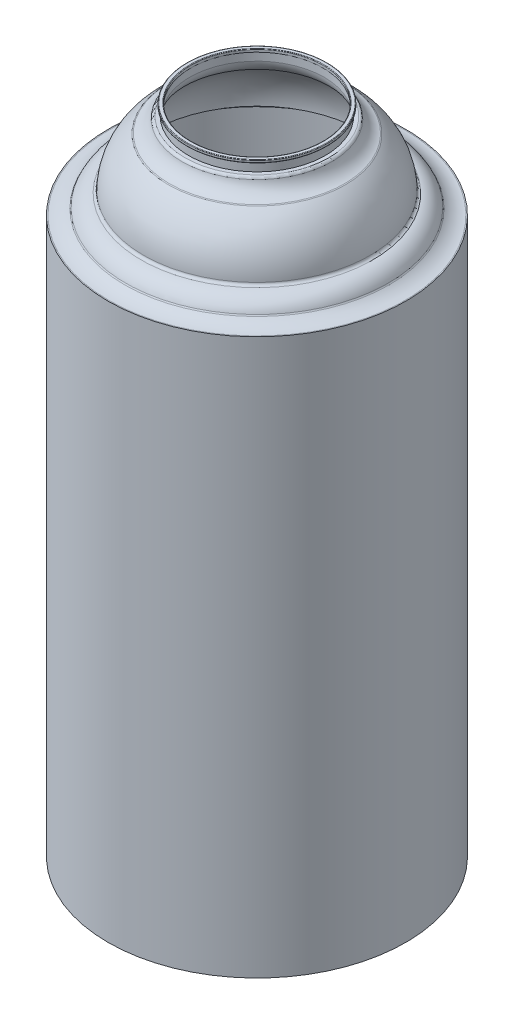
ISO-10303-21;
HEADER;
FILE_DESCRIPTION(('STEP AP214'),'2;1');
FILE_NAME('part.step','',(''),(''),'','','');
FILE_SCHEMA(('AUTOMOTIVE_DESIGN { 1 0 10303 214 1 1 1 1 }'));
ENDSEC;
DATA;
#1=APPLICATION_CONTEXT('core data for automotive mechanical design processes');
#2=APPLICATION_PROTOCOL_DEFINITION('international standard','automotive_design',2000,#1);
#3=PRODUCT_CONTEXT('',#1,'mechanical');
#4=PRODUCT('Part','Part','',(#3));
#5=PRODUCT_RELATED_PRODUCT_CATEGORY('part','',(#4));
#6=PRODUCT_DEFINITION_FORMATION('','',#4);
#7=PRODUCT_DEFINITION_CONTEXT('part definition',#1,'design');
#8=PRODUCT_DEFINITION('design','',#6,#7);
#9=PRODUCT_DEFINITION_SHAPE('','',#8);
#10=(LENGTH_UNIT() NAMED_UNIT(*) SI_UNIT(.MILLI.,.METRE.));
#11=(NAMED_UNIT(*) PLANE_ANGLE_UNIT() SI_UNIT($,.RADIAN.));
#12=(NAMED_UNIT(*) SI_UNIT($,.STERADIAN.) SOLID_ANGLE_UNIT());
#13=UNCERTAINTY_MEASURE_WITH_UNIT(LENGTH_MEASURE(1.E-05),#10,'distance_accuracy_value','');
#14=(GEOMETRIC_REPRESENTATION_CONTEXT(3) GLOBAL_UNCERTAINTY_ASSIGNED_CONTEXT((#13)) GLOBAL_UNIT_ASSIGNED_CONTEXT((#10,
#11,#12)) REPRESENTATION_CONTEXT('',''));
#15=CARTESIAN_POINT('',(0.,0.,0.));
#16=DIRECTION('',(0.,0.,1.));
#17=DIRECTION('',(1.,0.,0.));
#18=AXIS2_PLACEMENT_3D('',#15,#16,#17);
#19=CARTESIAN_POINT('',(4.78249918300067E-13,284.48,0.));
#20=DIRECTION('',(0.,-1.,0.));
#21=DIRECTION('',(0.,0.,-1.));
#22=AXIS2_PLACEMENT_3D('',#19,#20,#21);
#23=PLANE('',#22);
#24=CARTESIAN_POINT('',(0.,284.48,0.));
#25=DIRECTION('',(0.,-1.,0.));
#26=DIRECTION('',(0.,0.,-1.));
#27=AXIS2_PLACEMENT_3D('',#24,#25,#26);
#28=CIRCLE('',#27,31.9798450549602);
#29=CARTESIAN_POINT('',(0.,284.48,-31.9798450549602));
#30=VERTEX_POINT('',#29);
#31=EDGE_CURVE('E115',#30,#30,#28,.F.);
#32=ORIENTED_EDGE('',*,*,#31,.T.);
#33=EDGE_LOOP('',(#32));
#34=FACE_BOUND('',#33,.T.);
#35=CARTESIAN_POINT('',(0.,284.48,0.));
#36=DIRECTION('',(0.,-1.,0.));
#37=DIRECTION('',(0.,0.,-1.));
#38=AXIS2_PLACEMENT_3D('',#35,#36,#37);
#39=CIRCLE('',#38,30.353);
#40=CARTESIAN_POINT('',(0.,284.48,-30.353));
#41=VERTEX_POINT('',#40);
#42=EDGE_CURVE('E73',#41,#41,#39,.F.);
#43=ORIENTED_EDGE('',*,*,#42,.F.);
#44=EDGE_LOOP('',(#43));
#45=FACE_BOUND('',#44,.T.);
#46=ADVANCED_FACE('F41',(#34,#45),#23,.F.);
#47=CARTESIAN_POINT('',(0.,246.38,0.));
#48=DIRECTION('',(0.,1.,0.));
#49=DIRECTION('',(0.,0.,1.));
#50=AXIS2_PLACEMENT_3D('',#47,#48,#49);
#51=PLANE('',#50);
#52=CARTESIAN_POINT('',(0.,246.38,0.));
#53=DIRECTION('',(0.,1.,0.));
#54=DIRECTION('',(0.,0.,1.));
#55=AXIS2_PLACEMENT_3D('',#52,#53,#54);
#56=CIRCLE('',#55,65.5959050012918);
#57=CARTESIAN_POINT('',(0.,246.38,65.5959050012918));
#58=VERTEX_POINT('',#57);
#59=EDGE_CURVE('E87',#58,#58,#56,.F.);
#60=ORIENTED_EDGE('',*,*,#59,.T.);
#61=EDGE_LOOP('',(#60));
#62=FACE_BOUND('',#61,.T.);
#63=CARTESIAN_POINT('',(0.,246.38,0.));
#64=DIRECTION('',(0.,1.,0.));
#65=DIRECTION('',(0.,0.,1.));
#66=AXIS2_PLACEMENT_3D('',#63,#64,#65);
#67=CIRCLE('',#66,66.04);
#68=CARTESIAN_POINT('',(0.,246.38,66.04));
#69=VERTEX_POINT('',#68);
#70=EDGE_CURVE('E127',#69,#69,#67,.T.);
#71=ORIENTED_EDGE('',*,*,#70,.T.);
#72=EDGE_LOOP('',(#71));
#73=FACE_BOUND('',#72,.T.);
#74=ADVANCED_FACE('F195',(#62,#73),#51,.T.);
#75=CARTESIAN_POINT('',(0.,0.,0.));
#76=DIRECTION('',(0.,1.,0.));
#77=DIRECTION('',(0.,0.,1.));
#78=AXIS2_PLACEMENT_3D('',#75,#76,#77);
#79=PLANE('',#78);
#80=CARTESIAN_POINT('',(0.,0.,0.));
#81=DIRECTION('',(0.,1.,0.));
#82=DIRECTION('',(0.,0.,1.));
#83=AXIS2_PLACEMENT_3D('',#80,#81,#82);
#84=CIRCLE('',#83,66.04);
#85=CARTESIAN_POINT('',(0.,0.,66.04));
#86=VERTEX_POINT('',#85);
#87=EDGE_CURVE('E128',#86,#86,#84,.T.);
#88=ORIENTED_EDGE('',*,*,#87,.F.);
#89=EDGE_LOOP('',(#88));
#90=FACE_BOUND('',#89,.T.);
#91=CARTESIAN_POINT('',(0.,0.,0.));
#92=DIRECTION('',(0.,1.,0.));
#93=DIRECTION('',(0.,0.,1.));
#94=AXIS2_PLACEMENT_3D('',#91,#92,#93);
#95=CIRCLE('',#94,64.4525);
#96=CARTESIAN_POINT('',(0.,0.,64.4525));
#97=VERTEX_POINT('',#96);
#98=EDGE_CURVE('E132',#97,#97,#95,.T.);
#99=ORIENTED_EDGE('',*,*,#98,.T.);
#100=EDGE_LOOP('',(#99));
#101=FACE_BOUND('',#100,.T.);
#102=ADVANCED_FACE('F203',(#90,#101),#79,.F.);
#103=CARTESIAN_POINT('',(0.,246.38,0.));
#104=DIRECTION('',(0.,-1.,0.));
#105=DIRECTION('',(0.,0.,-1.));
#106=AXIS2_PLACEMENT_3D('',#103,#104,#105);
#107=CYLINDRICAL_SURFACE('',#106,66.04);
#108=ORIENTED_EDGE('',*,*,#87,.T.);
#109=EDGE_LOOP('',(#108));
#110=FACE_BOUND('',#109,.T.);
#111=ORIENTED_EDGE('',*,*,#70,.F.);
#112=EDGE_LOOP('',(#111));
#113=FACE_BOUND('',#112,.T.);
#114=ADVANCED_FACE('F228',(#110,#113),#107,.T.);
#115=CARTESIAN_POINT('',(0.,246.38,0.));
#116=DIRECTION('',(0.,-1.,0.));
#117=DIRECTION('',(0.,0.,-1.));
#118=AXIS2_PLACEMENT_3D('',#115,#116,#117);
#119=CYLINDRICAL_SURFACE('',#118,64.4525);
#120=CARTESIAN_POINT('',(0.,0.950658073217911,0.));
#121=DIRECTION('',(0.,-1.,0.));
#122=DIRECTION('',(0.,0.,-1.));
#123=AXIS2_PLACEMENT_3D('',#120,#121,#122);
#124=CIRCLE('',#123,64.4525);
#125=CARTESIAN_POINT('',(0.,0.950658073217911,-64.4525));
#126=VERTEX_POINT('',#125);
#127=EDGE_CURVE('E77',#126,#126,#124,.T.);
#128=ORIENTED_EDGE('',*,*,#127,.F.);
#129=EDGE_LOOP('',(#128));
#130=FACE_BOUND('',#129,.T.);
#131=ORIENTED_EDGE('',*,*,#98,.F.);
#132=EDGE_LOOP('',(#131));
#133=FACE_BOUND('',#132,.T.);
#134=ADVANCED_FACE('F225',(#130,#133),#119,.F.);
#135=CARTESIAN_POINT('',(0.,254.962138497177,0.));
#136=DIRECTION('',(0.,-1.,0.));
#137=DIRECTION('',(0.,0.,-1.));
#138=AXIS2_PLACEMENT_3D('',#135,#136,#137);
#139=DEGENERATE_TOROIDAL_SURFACE('',#138,21.6163914023813,28.6973388071028,.T.);
#140=CARTESIAN_POINT('',(0.,277.628260774221,0.));
#141=DIRECTION('',(0.,-1.,0.));
#142=DIRECTION('',(0.,0.,-1.));
#143=AXIS2_PLACEMENT_3D('',#140,#141,#142);
#144=CIRCLE('',#143,39.2170776257001);
#145=CARTESIAN_POINT('',(0.,277.628260774221,-39.2170776257001));
#146=VERTEX_POINT('',#145);
#147=EDGE_CURVE('E107',#146,#146,#144,.T.);
#148=ORIENTED_EDGE('',*,*,#147,.T.);
#149=EDGE_LOOP('',(#148));
#150=FACE_BOUND('',#149,.T.);
#151=CARTESIAN_POINT('',(0.,256.102520488577,0.));
#152=DIRECTION('',(0.,-1.,0.));
#153=DIRECTION('',(0.,0.,-1.));
#154=AXIS2_PLACEMENT_3D('',#151,#152,#153);
#155=CIRCLE('',#154,50.2910628655967);
#156=CARTESIAN_POINT('',(0.,256.102520488577,-50.2910628655967));
#157=VERTEX_POINT('',#156);
#158=EDGE_CURVE('E111',#157,#157,#155,.F.);
#159=ORIENTED_EDGE('',*,*,#158,.T.);
#160=EDGE_LOOP('',(#159));
#161=FACE_BOUND('',#160,.T.);
#162=ADVANCED_FACE('F227',(#150,#161),#139,.T.);
#163=CARTESIAN_POINT('',(0.,285.566494107584,0.));
#164=DIRECTION('',(0.,-1.,0.));
#165=DIRECTION('',(0.,0.,-1.));
#166=AXIS2_PLACEMENT_3D('',#163,#164,#165);
#167=TOROIDAL_SURFACE('',#166,40.9685680443677,8.02248112504837);
#168=CARTESIAN_POINT('',(0.,283.532061188649,0.));
#169=DIRECTION('',(0.,1.,0.));
#170=DIRECTION('',(0.,0.,1.));
#171=AXIS2_PLACEMENT_3D('',#168,#169,#170);
#172=CIRCLE('',#171,33.2083305415517);
#173=CARTESIAN_POINT('',(0.,283.532061188649,33.2083305415517));
#174=VERTEX_POINT('',#173);
#175=EDGE_CURVE('E119',#174,#174,#172,.F.);
#176=ORIENTED_EDGE('',*,*,#175,.T.);
#177=EDGE_LOOP('',(#176));
#178=FACE_BOUND('',#177,.T.);
#179=CARTESIAN_POINT('',(0.,277.847179319122,0.));
#180=DIRECTION('',(0.,1.,0.));
#181=DIRECTION('',(0.,0.,1.));
#182=AXIS2_PLACEMENT_3D('',#179,#180,#181);
#183=CIRCLE('',#182,38.783989687248);
#184=CARTESIAN_POINT('',(0.,277.847179319122,38.783989687248));
#185=VERTEX_POINT('',#184);
#186=EDGE_CURVE('E123',#185,#185,#183,.T.);
#187=ORIENTED_EDGE('',*,*,#186,.T.);
#188=EDGE_LOOP('',(#187));
#189=FACE_BOUND('',#188,.T.);
#190=ADVANCED_FACE('F209',(#178,#189),#167,.F.);
#191=CARTESIAN_POINT('',(0.,257.501093261794,0.));
#192=DIRECTION('',(0.,-1.,0.));
#193=DIRECTION('',(0.,0.,-1.));
#194=AXIS2_PLACEMENT_3D('',#191,#192,#193);
#195=TOROIDAL_SURFACE('',#194,65.8112238839883,11.1234461318774);
#196=CARTESIAN_POINT('',(0.,248.955422133642,0.));
#197=DIRECTION('',(0.,1.,0.));
#198=DIRECTION('',(0.,0.,1.));
#199=AXIS2_PLACEMENT_3D('',#196,#197,#198);
#200=CIRCLE('',#199,58.6906509563203);
#201=CARTESIAN_POINT('',(0.,248.955422133642,58.6906509563203));
#202=VERTEX_POINT('',#201);
#203=EDGE_CURVE('E91',#202,#202,#200,.F.);
#204=ORIENTED_EDGE('',*,*,#203,.T.);
#205=EDGE_LOOP('',(#204));
#206=FACE_BOUND('',#205,.T.);
#207=CARTESIAN_POINT('',(0.,246.380303258923,0.));
#208=DIRECTION('',(0.,1.,0.));
#209=DIRECTION('',(0.,0.,1.));
#210=AXIS2_PLACEMENT_3D('',#207,#208,#209);
#211=CIRCLE('',#210,65.5681527837068);
#212=CARTESIAN_POINT('',(0.,246.380303258923,65.5681527837068));
#213=VERTEX_POINT('',#212);
#214=EDGE_CURVE('E95',#213,#213,#211,.T.);
#215=ORIENTED_EDGE('',*,*,#214,.T.);
#216=EDGE_LOOP('',(#215));
#217=FACE_BOUND('',#216,.T.);
#218=ADVANCED_FACE('F216',(#206,#217),#195,.F.);
#219=CARTESIAN_POINT('',(0.,246.38,0.));
#220=DIRECTION('',(0.,-1.,0.));
#221=DIRECTION('',(0.,0.,-1.));
#222=AXIS2_PLACEMENT_3D('',#219,#220,#221);
#223=TOROIDAL_SURFACE('',#222,50.3137302094841,8.58213849717667);
#224=CARTESIAN_POINT('',(0.,254.893191032186,0.));
#225=DIRECTION('',(0.,-1.,0.));
#226=DIRECTION('',(0.,0.,-1.));
#227=AXIS2_PLACEMENT_3D('',#224,#225,#226);
#228=CIRCLE('',#227,51.399400340903);
#229=CARTESIAN_POINT('',(0.,254.893191032186,-51.399400340903));
#230=VERTEX_POINT('',#229);
#231=EDGE_CURVE('E99',#230,#230,#228,.T.);
#232=ORIENTED_EDGE('',*,*,#231,.T.);
#233=EDGE_LOOP('',(#232));
#234=FACE_BOUND('',#233,.T.);
#235=CARTESIAN_POINT('',(0.,249.47334981781,0.));
#236=DIRECTION('',(0.,-1.,0.));
#237=DIRECTION('',(0.,0.,-1.));
#238=AXIS2_PLACEMENT_3D('',#235,#236,#237);
#239=CIRCLE('',#238,58.3189964817185);
#240=CARTESIAN_POINT('',(0.,249.47334981781,-58.3189964817185));
#241=VERTEX_POINT('',#240);
#242=EDGE_CURVE('E103',#241,#241,#239,.F.);
#243=ORIENTED_EDGE('',*,*,#242,.T.);
#244=EDGE_LOOP('',(#243));
#245=FACE_BOUND('',#244,.T.);
#246=ADVANCED_FACE('F219',(#234,#245),#223,.T.);
#247=CARTESIAN_POINT('',(0.,283.21,0.));
#248=DIRECTION('',(0.,1.,0.));
#249=DIRECTION('',(0.,0.,1.));
#250=AXIS2_PLACEMENT_3D('',#247,#248,#249);
#251=TOROIDAL_SURFACE('',#250,31.9798450549602,1.27);
#252=ORIENTED_EDGE('',*,*,#31,.F.);
#253=EDGE_LOOP('',(#252));
#254=FACE_BOUND('',#253,.T.);
#255=ORIENTED_EDGE('',*,*,#175,.F.);
#256=EDGE_LOOP('',(#255));
#257=FACE_BOUND('',#256,.T.);
#258=ADVANCED_FACE('F223',(#254,#257),#251,.T.);
#259=CARTESIAN_POINT('',(0.,276.625172108567,0.));
#260=DIRECTION('',(0.,1.,0.));
#261=DIRECTION('',(0.,0.,1.));
#262=AXIS2_PLACEMENT_3D('',#259,#260,#261);
#263=TOROIDAL_SURFACE('',#262,38.4381597039425,1.27);
#264=ORIENTED_EDGE('',*,*,#186,.F.);
#265=EDGE_LOOP('',(#264));
#266=FACE_BOUND('',#265,.T.);
#267=ORIENTED_EDGE('',*,*,#147,.F.);
#268=EDGE_LOOP('',(#267));
#269=FACE_BOUND('',#268,.T.);
#270=ADVANCED_FACE('F239',(#266,#269),#263,.T.);
#271=CARTESIAN_POINT('',(0.,256.152988064641,0.));
#272=DIRECTION('',(0.,-1.,0.));
#273=DIRECTION('',(0.,0.,-1.));
#274=AXIS2_PLACEMENT_3D('',#271,#272,#273);
#275=TOROIDAL_SURFACE('',#274,51.5600597228687,1.27);
#276=ORIENTED_EDGE('',*,*,#158,.F.);
#277=EDGE_LOOP('',(#276));
#278=FACE_BOUND('',#277,.T.);
#279=ORIENTED_EDGE('',*,*,#231,.F.);
#280=EDGE_LOOP('',(#279));
#281=FACE_BOUND('',#280,.T.);
#282=ADVANCED_FACE('F243',(#278,#281),#275,.F.);
#283=CARTESIAN_POINT('',(0.,249.931109182788,0.));
#284=DIRECTION('',(0.,-1.,0.));
#285=DIRECTION('',(0.,0.,-1.));
#286=AXIS2_PLACEMENT_3D('',#283,#284,#285);
#287=TOROIDAL_SURFACE('',#286,59.5036299118458,1.27);
#288=ORIENTED_EDGE('',*,*,#242,.F.);
#289=EDGE_LOOP('',(#288));
#290=FACE_BOUND('',#289,.T.);
#291=ORIENTED_EDGE('',*,*,#203,.F.);
#292=EDGE_LOOP('',(#291));
#293=FACE_BOUND('',#292,.T.);
#294=ADVANCED_FACE('F247',(#290,#293),#287,.F.);
#295=CARTESIAN_POINT('',(0.,247.65,0.));
#296=DIRECTION('',(0.,-1.,0.));
#297=DIRECTION('',(0.,0.,-1.));
#298=AXIS2_PLACEMENT_3D('',#295,#296,#297);
#299=TOROIDAL_SURFACE('',#298,65.5959050012918,1.27);
#300=ORIENTED_EDGE('',*,*,#214,.F.);
#301=EDGE_LOOP('',(#300));
#302=FACE_BOUND('',#301,.T.);
#303=ORIENTED_EDGE('',*,*,#59,.F.);
#304=EDGE_LOOP('',(#303));
#305=FACE_BOUND('',#304,.T.);
#306=ADVANCED_FACE('F251',(#302,#305),#299,.F.);
#307=CARTESIAN_POINT('',(0.,-108.479115040638,0.));
#308=DIRECTION('',(0.,1.,0.));
#309=DIRECTION('',(0.,0.,1.));
#310=AXIS2_PLACEMENT_3D('',#307,#308,#309);
#311=SPHERICAL_SURFACE('',#310,127.);
#312=ORIENTED_EDGE('',*,*,#127,.T.);
#313=EDGE_LOOP('',(#312));
#314=FACE_BOUND('',#313,.T.);
#315=ADVANCED_FACE('F255',(#314),#311,.F.);
#316=CARTESIAN_POINT('',(0.,288.29,0.));
#317=DIRECTION('',(0.,-1.,0.));
#318=DIRECTION('',(0.,0.,-1.));
#319=AXIS2_PLACEMENT_3D('',#316,#317,#318);
#320=CYLINDRICAL_SURFACE('',#319,30.353);
#321=CARTESIAN_POINT('',(0.,288.29,0.));
#322=DIRECTION('',(0.,1.,0.));
#323=DIRECTION('',(0.,0.,1.));
#324=AXIS2_PLACEMENT_3D('',#321,#322,#323);
#325=CIRCLE('',#324,30.353);
#326=CARTESIAN_POINT('',(0.,288.29,-30.353));
#327=VERTEX_POINT('',#326);
#328=EDGE_CURVE('E161',#327,#327,#325,.T.);
#329=CARTESIAN_POINT('',(0.,288.29,-30.353));
#330=CARTESIAN_POINT('',(0.,288.2503125,-30.353));
#331=CARTESIAN_POINT('',(0.,288.210625,-30.353));
#332=CARTESIAN_POINT('',(0.,288.13125,-30.353));
#333=CARTESIAN_POINT('',(0.,288.0915625,-30.353));
#334=CARTESIAN_POINT('',(0.,288.0121875,-30.353));
#335=CARTESIAN_POINT('',(0.,287.9725,-30.353));
#336=CARTESIAN_POINT('',(0.,287.893125,-30.353));
#337=CARTESIAN_POINT('',(0.,287.8534375,-30.353));
#338=CARTESIAN_POINT('',(0.,287.7740625,-30.353));
#339=CARTESIAN_POINT('',(0.,287.734375,-30.353));
#340=CARTESIAN_POINT('',(0.,287.655,-30.353));
#341=CARTESIAN_POINT('',(0.,287.6153125,-30.353));
#342=CARTESIAN_POINT('',(0.,287.5359375,-30.353));
#343=CARTESIAN_POINT('',(0.,287.49625,-30.353));
#344=CARTESIAN_POINT('',(0.,287.416875,-30.353));
#345=CARTESIAN_POINT('',(0.,287.3771875,-30.353));
#346=CARTESIAN_POINT('',(0.,287.2978125,-30.353));
#347=CARTESIAN_POINT('',(0.,287.258125,-30.353));
#348=CARTESIAN_POINT('',(0.,287.17875,-30.353));
#349=CARTESIAN_POINT('',(0.,287.1390625,-30.353));
#350=CARTESIAN_POINT('',(0.,287.0596875,-30.353));
#351=CARTESIAN_POINT('',(0.,287.02,-30.353));
#352=CARTESIAN_POINT('',(0.,286.940625,-30.353));
#353=CARTESIAN_POINT('',(0.,286.9009375,-30.353));
#354=CARTESIAN_POINT('',(0.,286.8215625,-30.353));
#355=CARTESIAN_POINT('',(0.,286.781875,-30.353));
#356=CARTESIAN_POINT('',(0.,286.7025,-30.353));
#357=CARTESIAN_POINT('',(0.,286.6628125,-30.353));
#358=CARTESIAN_POINT('',(0.,286.5834375,-30.353));
#359=CARTESIAN_POINT('',(0.,286.54375,-30.353));
#360=CARTESIAN_POINT('',(0.,286.464375,-30.353));
#361=CARTESIAN_POINT('',(0.,286.4246875,-30.353));
#362=CARTESIAN_POINT('',(0.,286.3453125,-30.353));
#363=CARTESIAN_POINT('',(0.,286.305625,-30.353));
#364=CARTESIAN_POINT('',(0.,286.22625,-30.353));
#365=CARTESIAN_POINT('',(0.,286.1865625,-30.353));
#366=CARTESIAN_POINT('',(0.,286.1071875,-30.353));
#367=CARTESIAN_POINT('',(0.,286.0675,-30.353));
#368=CARTESIAN_POINT('',(0.,285.988125,-30.353));
#369=CARTESIAN_POINT('',(0.,285.9484375,-30.353));
#370=CARTESIAN_POINT('',(0.,285.8690625,-30.353));
#371=CARTESIAN_POINT('',(0.,285.829375,-30.353));
#372=CARTESIAN_POINT('',(0.,285.75,-30.353));
#373=CARTESIAN_POINT('',(0.,285.7103125,-30.353));
#374=CARTESIAN_POINT('',(0.,285.6309375,-30.353));
#375=CARTESIAN_POINT('',(0.,285.59125,-30.353));
#376=CARTESIAN_POINT('',(0.,285.511875,-30.353));
#377=CARTESIAN_POINT('',(0.,285.4721875,-30.353));
#378=CARTESIAN_POINT('',(0.,285.3928125,-30.353));
#379=CARTESIAN_POINT('',(0.,285.353125,-30.353));
#380=CARTESIAN_POINT('',(0.,285.27375,-30.353));
#381=CARTESIAN_POINT('',(0.,285.2340625,-30.353));
#382=CARTESIAN_POINT('',(0.,285.1546875,-30.353));
#383=CARTESIAN_POINT('',(0.,285.115,-30.353));
#384=CARTESIAN_POINT('',(0.,285.035625,-30.353));
#385=CARTESIAN_POINT('',(0.,284.9959375,-30.353));
#386=CARTESIAN_POINT('',(0.,284.9165625,-30.353));
#387=CARTESIAN_POINT('',(0.,284.876875,-30.353));
#388=CARTESIAN_POINT('',(0.,284.7975,-30.353));
#389=CARTESIAN_POINT('',(0.,284.7578125,-30.353));
#390=CARTESIAN_POINT('',(0.,284.6784375,-30.353));
#391=CARTESIAN_POINT('',(0.,284.63875,-30.353));
#392=CARTESIAN_POINT('',(0.,284.559375,-30.353));
#393=CARTESIAN_POINT('',(0.,284.5196875,-30.353));
#394=CARTESIAN_POINT('',(0.,284.48,-30.353));
#395=B_SPLINE_CURVE_WITH_KNOTS('',3,(#329,#330,#331,#332,#333,#334,#335,#336,#337,#338,#339,
#340,#341,#342,#343,#344,#345,#346,#347,#348,#349,#350,#351,#352,#353,#354,#355,#356,#357,#358,
#359,#360,#361,#362,#363,#364,#365,#366,#367,#368,#369,#370,#371,#372,#373,#374,#375,#376,#377,
#378,#379,#380,#381,#382,#383,#384,#385,#386,#387,#388,#389,#390,#391,#392,#393,#394),
.UNSPECIFIED.,.F.,.F.,(4,2,2,2,2,2,2,2,2,2,2,2,2,2,2,2,2,2,2,2,2,2,2,2,2,2,2,2,2,2,2,2,4),(0.,
0.119062499999989,0.238124999999978,0.357187499999967,0.476249999999956,0.595312499999945,
0.714374999999934,0.833437499999978,0.952499999999967,1.07156249999996,1.19062499999995,
1.30968749999993,1.42874999999992,1.54781249999997,1.66687499999996,1.78593749999995,
1.90499999999993,2.02406249999992,2.14312499999991,2.2621874999999,2.38124999999995,
2.50031249999993,2.61937499999992,2.73843749999991,2.8574999999999,2.97656249999989,
3.09562499999994,3.21468749999992,3.33374999999991,3.4528124999999,3.57187499999989,
3.69093749999988,3.80999999999987),.UNSPECIFIED.);
#396=EDGE_CURVE('BSEAM279',#327,#41,#395,.T.);
#397=ORIENTED_EDGE('',*,*,#328,.F.);
#398=ORIENTED_EDGE('',*,*,#42,.T.);
#399=ORIENTED_EDGE('',*,*,#396,.T.);
#400=ORIENTED_EDGE('',*,*,#396,.F.);
#401=EDGE_LOOP('',(#397,#399,#398,#400));
#402=FACE_BOUND('',#401,.T.);
#403=ADVANCED_FACE('F279',(#402),#320,.T.);
#404=CARTESIAN_POINT('',(0.,288.29,0.));
#405=DIRECTION('',(0.,1.,0.));
#406=DIRECTION('',(0.,0.,1.));
#407=AXIS2_PLACEMENT_3D('',#404,#405,#406);
#408=PLANE('',#407);
#409=CARTESIAN_POINT('',(0.,288.29,0.));
#410=DIRECTION('',(0.,1.,0.));
#411=DIRECTION('',(0.,0.,1.));
#412=AXIS2_PLACEMENT_3D('',#409,#410,#411);
#413=CIRCLE('',#412,29.337);
#414=CARTESIAN_POINT('',(0.,288.29,29.337));
#415=VERTEX_POINT('',#414);
#416=EDGE_CURVE('E169',#415,#415,#413,.T.);
#417=ORIENTED_EDGE('',*,*,#416,.T.);
#418=EDGE_LOOP('',(#417));
#419=FACE_BOUND('',#418,.T.);
#420=CARTESIAN_POINT('',(0.,288.29,0.));
#421=DIRECTION('',(0.,1.,0.));
#422=DIRECTION('',(0.,0.,1.));
#423=AXIS2_PLACEMENT_3D('',#420,#421,#422);
#424=CIRCLE('',#423,29.845);
#425=CARTESIAN_POINT('',(0.,288.29,-29.845));
#426=VERTEX_POINT('',#425);
#427=EDGE_CURVE('E165',#426,#426,#424,.T.);
#428=ORIENTED_EDGE('',*,*,#427,.F.);
#429=EDGE_LOOP('',(#428));
#430=FACE_BOUND('',#429,.T.);
#431=ADVANCED_FACE('F174',(#419,#430),#408,.F.);
#432=CARTESIAN_POINT('',(0.,289.56,0.));
#433=DIRECTION('',(0.,1.,0.));
#434=DIRECTION('',(0.,0.,1.));
#435=AXIS2_PLACEMENT_3D('',#432,#433,#434);
#436=PLANE('',#435);
#437=CARTESIAN_POINT('',(0.,289.56,0.));
#438=DIRECTION('',(0.,1.,0.));
#439=DIRECTION('',(0.,0.,1.));
#440=AXIS2_PLACEMENT_3D('',#437,#438,#439);
#441=CIRCLE('',#440,29.591);
#442=CARTESIAN_POINT('',(0.,289.56,29.591));
#443=VERTEX_POINT('',#442);
#444=EDGE_CURVE('E59',#443,#443,#441,.F.);
#445=ORIENTED_EDGE('',*,*,#444,.T.);
#446=EDGE_LOOP('',(#445));
#447=FACE_BOUND('',#446,.T.);
#448=CARTESIAN_POINT('',(0.,289.56,0.));
#449=DIRECTION('',(0.,1.,0.));
#450=DIRECTION('',(0.,0.,1.));
#451=AXIS2_PLACEMENT_3D('',#448,#449,#450);
#452=CIRCLE('',#451,30.8049864475479);
#453=CARTESIAN_POINT('',(0.,289.56,30.8049864475479));
#454=VERTEX_POINT('',#453);
#455=EDGE_CURVE('E65',#454,#454,#452,.T.);
#456=ORIENTED_EDGE('',*,*,#455,.T.);
#457=EDGE_LOOP('',(#456));
#458=FACE_BOUND('',#457,.T.);
#459=ADVANCED_FACE('F271',(#447,#458),#436,.T.);
#460=CARTESIAN_POINT('',(0.,288.29,0.));
#461=DIRECTION('',(0.,1.,0.));
#462=DIRECTION('',(0.,0.,1.));
#463=AXIS2_PLACEMENT_3D('',#460,#461,#462);
#464=CIRCLE('',#463,30.8049864475479);
#465=CARTESIAN_POINT('',(0.,288.29,30.8049864475479));
#466=VERTEX_POINT('',#465);
#467=EDGE_CURVE('E10',#466,#466,#464,.F.);
#468=ORIENTED_EDGE('',*,*,#467,.T.);
#469=EDGE_LOOP('',(#468));
#470=FACE_BOUND('',#469,.T.);
#471=ORIENTED_EDGE('',*,*,#328,.T.);
#472=EDGE_LOOP('',(#471));
#473=FACE_BOUND('',#472,.T.);
#474=ADVANCED_FACE('F191',(#470,#473),#408,.F.);
#475=CARTESIAN_POINT('',(0.,289.56,0.));
#476=DIRECTION('',(0.,-1.,0.));
#477=DIRECTION('',(0.,0.,-1.));
#478=AXIS2_PLACEMENT_3D('',#475,#476,#477);
#479=CYLINDRICAL_SURFACE('',#478,31.0589864475479);
#480=CARTESIAN_POINT('',(0.,289.306,0.));
#481=DIRECTION('',(0.,1.,0.));
#482=DIRECTION('',(0.,0.,1.));
#483=AXIS2_PLACEMENT_3D('',#480,#481,#482);
#484=CIRCLE('',#483,31.0589864475479);
#485=CARTESIAN_POINT('',(0.,289.306,31.0589864475479));
#486=VERTEX_POINT('',#485);
#487=EDGE_CURVE('E49',#486,#486,#484,.F.);
#488=ORIENTED_EDGE('',*,*,#487,.T.);
#489=EDGE_LOOP('',(#488));
#490=FACE_BOUND('',#489,.T.);
#491=CARTESIAN_POINT('',(0.,288.544,0.));
#492=DIRECTION('',(0.,1.,0.));
#493=DIRECTION('',(0.,0.,1.));
#494=AXIS2_PLACEMENT_3D('',#491,#492,#493);
#495=CIRCLE('',#494,31.0589864475479);
#496=CARTESIAN_POINT('',(0.,288.544,31.0589864475479));
#497=VERTEX_POINT('',#496);
#498=EDGE_CURVE('E54',#497,#497,#495,.T.);
#499=ORIENTED_EDGE('',*,*,#498,.T.);
#500=EDGE_LOOP('',(#499));
#501=FACE_BOUND('',#500,.T.);
#502=ADVANCED_FACE('F180',(#490,#501),#479,.T.);
#503=CARTESIAN_POINT('',(0.,289.56,0.));
#504=DIRECTION('',(0.,-1.,0.));
#505=DIRECTION('',(0.,0.,-1.));
#506=AXIS2_PLACEMENT_3D('',#503,#504,#505);
#507=CYLINDRICAL_SURFACE('',#506,29.337);
#508=CARTESIAN_POINT('',(0.,289.306,0.));
#509=DIRECTION('',(0.,1.,0.));
#510=DIRECTION('',(0.,0.,1.));
#511=AXIS2_PLACEMENT_3D('',#508,#509,#510);
#512=CIRCLE('',#511,29.337);
#513=CARTESIAN_POINT('',(0.,289.306,29.337));
#514=VERTEX_POINT('',#513);
#515=EDGE_CURVE('E69',#514,#514,#512,.T.);
#516=ORIENTED_EDGE('',*,*,#515,.T.);
#517=EDGE_LOOP('',(#516));
#518=FACE_BOUND('',#517,.T.);
#519=ORIENTED_EDGE('',*,*,#416,.F.);
#520=EDGE_LOOP('',(#519));
#521=FACE_BOUND('',#520,.T.);
#522=ADVANCED_FACE('F177',(#518,#521),#507,.F.);
#523=CARTESIAN_POINT('',(0.,-105.304115040638,0.));
#524=DIRECTION('',(0.,1.,0.));
#525=DIRECTION('',(0.,0.,1.));
#526=AXIS2_PLACEMENT_3D('',#523,#524,#525);
#527=SPHERICAL_SURFACE('',#526,127.);
#528=CARTESIAN_POINT('',(0.,4.12565807321789,0.));
#529=DIRECTION('',(0.,-1.,0.));
#530=DIRECTION('',(0.,0.,-1.));
#531=AXIS2_PLACEMENT_3D('',#528,#529,#530);
#532=CIRCLE('',#531,64.4525);
#533=CARTESIAN_POINT('',(0.,4.12565807321789,-64.4525));
#534=VERTEX_POINT('',#533);
#535=EDGE_CURVE('E78',#534,#534,#532,.T.);
#536=ORIENTED_EDGE('',*,*,#535,.F.);
#537=EDGE_LOOP('',(#536));
#538=FACE_BOUND('',#537,.T.);
#539=ADVANCED_FACE('F179',(#538),#527,.T.);
#540=CARTESIAN_POINT('',(0.,246.38,0.));
#541=DIRECTION('',(0.,1.,0.));
#542=DIRECTION('',(0.,0.,1.));
#543=AXIS2_PLACEMENT_3D('',#540,#541,#542);
#544=CIRCLE('',#543,64.4525);
#545=CARTESIAN_POINT('',(0.,246.38,64.4525));
#546=VERTEX_POINT('',#545);
#547=EDGE_CURVE('E82',#546,#546,#544,.T.);
#548=ORIENTED_EDGE('',*,*,#547,.T.);
#549=EDGE_LOOP('',(#548));
#550=FACE_BOUND('',#549,.T.);
#551=ORIENTED_EDGE('',*,*,#535,.T.);
#552=EDGE_LOOP('',(#551));
#553=FACE_BOUND('',#552,.T.);
#554=ADVANCED_FACE('F188',(#550,#553),#119,.F.);
#555=CARTESIAN_POINT('',(0.,246.38,0.));
#556=DIRECTION('',(0.,1.,0.));
#557=DIRECTION('',(0.,0.,1.));
#558=AXIS2_PLACEMENT_3D('',#555,#556,#557);
#559=PLANE('',#558);
#560=CARTESIAN_POINT('',(0.,246.38,0.));
#561=DIRECTION('',(0.,-1.,0.));
#562=DIRECTION('',(0.,0.,-1.));
#563=AXIS2_PLACEMENT_3D('',#560,#561,#562);
#564=CIRCLE('',#563,60.0920862213223);
#565=CARTESIAN_POINT('',(0.,246.38,-60.0920862213223));
#566=VERTEX_POINT('',#565);
#567=EDGE_CURVE('E145',#566,#566,#564,.T.);
#568=ORIENTED_EDGE('',*,*,#567,.F.);
#569=EDGE_LOOP('',(#568));
#570=FACE_BOUND('',#569,.T.);
#571=ORIENTED_EDGE('',*,*,#547,.F.);
#572=EDGE_LOOP('',(#571));
#573=FACE_BOUND('',#572,.T.);
#574=ADVANCED_FACE('F211',(#570,#573),#559,.F.);
#575=CARTESIAN_POINT('',(0.,257.098518287018,0.));
#576=DIRECTION('',(0.,-1.,0.));
#577=DIRECTION('',(0.,0.,-1.));
#578=AXIS2_PLACEMENT_3D('',#575,#576,#577);
#579=TOROIDAL_SURFACE('',#578,63.0660431106612,11.1234461318774);
#580=ORIENTED_EDGE('',*,*,#567,.T.);
#581=EDGE_LOOP('',(#580));
#582=FACE_BOUND('',#581,.T.);
#583=CARTESIAN_POINT('',(0.,249.184097363107,0.));
#584=DIRECTION('',(0.,-1.,0.));
#585=DIRECTION('',(0.,0.,-1.));
#586=AXIS2_PLACEMENT_3D('',#583,#584,#585);
#587=CIRCLE('',#586,55.2498422887825);
#588=CARTESIAN_POINT('',(0.,249.184097363107,-55.2498422887825));
#589=VERTEX_POINT('',#588);
#590=EDGE_CURVE('E83',#589,#589,#587,.T.);
#591=ORIENTED_EDGE('',*,*,#590,.F.);
#592=EDGE_LOOP('',(#591));
#593=FACE_BOUND('',#592,.T.);
#594=ADVANCED_FACE('F214',(#582,#593),#579,.T.);
#595=CARTESIAN_POINT('',(0.,246.38,0.));
#596=DIRECTION('',(0.,-1.,0.));
#597=DIRECTION('',(0.,0.,-1.));
#598=AXIS2_PLACEMENT_3D('',#595,#596,#597);
#599=TOROIDAL_SURFACE('',#598,47.1387302094841,8.58213849717667);
#600=ORIENTED_EDGE('',*,*,#590,.T.);
#601=EDGE_LOOP('',(#600));
#602=FACE_BOUND('',#601,.T.);
#603=CARTESIAN_POINT('',(0.,254.962138497177,0.));
#604=DIRECTION('',(0.,-1.,0.));
#605=DIRECTION('',(0.,0.,-1.));
#606=AXIS2_PLACEMENT_3D('',#603,#604,#605);
#607=CIRCLE('',#606,47.1387302094841);
#608=CARTESIAN_POINT('',(0.,254.962138497177,-47.1387302094841));
#609=VERTEX_POINT('',#608);
#610=EDGE_CURVE('E157',#609,#609,#607,.T.);
#611=ORIENTED_EDGE('',*,*,#610,.F.);
#612=EDGE_LOOP('',(#611));
#613=FACE_BOUND('',#612,.T.);
#614=ADVANCED_FACE('F290',(#602,#613),#599,.F.);
#615=CARTESIAN_POINT('',(0.,254.962138497177,0.));
#616=DIRECTION('',(0.,-1.,0.));
#617=DIRECTION('',(0.,0.,-1.));
#618=AXIS2_PLACEMENT_3D('',#615,#616,#617);
#619=DEGENERATE_TOROIDAL_SURFACE('',#618,18.4413914023813,28.6973388071028,.T.);
#620=CARTESIAN_POINT('',(0.,277.786372726395,0.));
#621=DIRECTION('',(0.,-1.,0.));
#622=DIRECTION('',(0.,0.,-1.));
#623=AXIS2_PLACEMENT_3D('',#620,#621,#622);
#624=CIRCLE('',#623,35.8365512596353);
#625=CARTESIAN_POINT('',(0.,277.786372726395,-35.8365512596353));
#626=VERTEX_POINT('',#625);
#627=EDGE_CURVE('E153',#626,#626,#624,.T.);
#628=ORIENTED_EDGE('',*,*,#627,.F.);
#629=EDGE_LOOP('',(#628));
#630=FACE_BOUND('',#629,.T.);
#631=ORIENTED_EDGE('',*,*,#610,.T.);
#632=EDGE_LOOP('',(#631));
#633=FACE_BOUND('',#632,.T.);
#634=ADVANCED_FACE('F287',(#630,#633),#619,.F.);
#635=CARTESIAN_POINT('',(0.,285.566494107584,0.));
#636=DIRECTION('',(0.,-1.,0.));
#637=DIRECTION('',(0.,0.,-1.));
#638=AXIS2_PLACEMENT_3D('',#635,#636,#637);
#639=TOROIDAL_SURFACE('',#638,37.7935680443677,8.02248112504838);
#640=ORIENTED_EDGE('',*,*,#627,.T.);
#641=EDGE_LOOP('',(#640));
#642=FACE_BOUND('',#641,.T.);
#643=CARTESIAN_POINT('',(0.,284.48,0.));
#644=DIRECTION('',(0.,-1.,0.));
#645=DIRECTION('',(0.,0.,-1.));
#646=AXIS2_PLACEMENT_3D('',#643,#644,#645);
#647=CIRCLE('',#646,29.845);
#648=CARTESIAN_POINT('',(0.,284.48,-29.845));
#649=VERTEX_POINT('',#648);
#650=EDGE_CURVE('E149',#649,#649,#647,.T.);
#651=ORIENTED_EDGE('',*,*,#650,.F.);
#652=EDGE_LOOP('',(#651));
#653=FACE_BOUND('',#652,.T.);
#654=ADVANCED_FACE('F282',(#642,#653),#639,.T.);
#655=CARTESIAN_POINT('',(0.,288.29,0.));
#656=DIRECTION('',(0.,-1.,0.));
#657=DIRECTION('',(0.,0.,-1.));
#658=AXIS2_PLACEMENT_3D('',#655,#656,#657);
#659=CYLINDRICAL_SURFACE('',#658,29.845);
#660=CARTESIAN_POINT('',(0.,288.29,-29.845));
#661=CARTESIAN_POINT('',(0.,288.2503125,-29.845));
#662=CARTESIAN_POINT('',(0.,288.210625,-29.845));
#663=CARTESIAN_POINT('',(0.,288.13125,-29.845));
#664=CARTESIAN_POINT('',(0.,288.0915625,-29.845));
#665=CARTESIAN_POINT('',(0.,288.0121875,-29.845));
#666=CARTESIAN_POINT('',(0.,287.9725,-29.845));
#667=CARTESIAN_POINT('',(0.,287.893125,-29.845));
#668=CARTESIAN_POINT('',(0.,287.8534375,-29.845));
#669=CARTESIAN_POINT('',(0.,287.7740625,-29.845));
#670=CARTESIAN_POINT('',(0.,287.734375,-29.845));
#671=CARTESIAN_POINT('',(0.,287.655,-29.845));
#672=CARTESIAN_POINT('',(0.,287.6153125,-29.845));
#673=CARTESIAN_POINT('',(0.,287.5359375,-29.845));
#674=CARTESIAN_POINT('',(0.,287.49625,-29.845));
#675=CARTESIAN_POINT('',(0.,287.416875,-29.845));
#676=CARTESIAN_POINT('',(0.,287.3771875,-29.845));
#677=CARTESIAN_POINT('',(0.,287.2978125,-29.845));
#678=CARTESIAN_POINT('',(0.,287.258125,-29.845));
#679=CARTESIAN_POINT('',(0.,287.17875,-29.845));
#680=CARTESIAN_POINT('',(0.,287.1390625,-29.845));
#681=CARTESIAN_POINT('',(0.,287.0596875,-29.845));
#682=CARTESIAN_POINT('',(0.,287.02,-29.845));
#683=CARTESIAN_POINT('',(0.,286.940625,-29.845));
#684=CARTESIAN_POINT('',(0.,286.9009375,-29.845));
#685=CARTESIAN_POINT('',(0.,286.8215625,-29.845));
#686=CARTESIAN_POINT('',(0.,286.781875,-29.845));
#687=CARTESIAN_POINT('',(0.,286.7025,-29.845));
#688=CARTESIAN_POINT('',(0.,286.6628125,-29.845));
#689=CARTESIAN_POINT('',(0.,286.5834375,-29.845));
#690=CARTESIAN_POINT('',(0.,286.54375,-29.845));
#691=CARTESIAN_POINT('',(0.,286.464375,-29.845));
#692=CARTESIAN_POINT('',(0.,286.4246875,-29.845));
#693=CARTESIAN_POINT('',(0.,286.3453125,-29.845));
#694=CARTESIAN_POINT('',(0.,286.305625,-29.845));
#695=CARTESIAN_POINT('',(0.,286.22625,-29.845));
#696=CARTESIAN_POINT('',(0.,286.1865625,-29.845));
#697=CARTESIAN_POINT('',(0.,286.1071875,-29.845));
#698=CARTESIAN_POINT('',(0.,286.0675,-29.845));
#699=CARTESIAN_POINT('',(0.,285.988125,-29.845));
#700=CARTESIAN_POINT('',(0.,285.9484375,-29.845));
#701=CARTESIAN_POINT('',(0.,285.8690625,-29.845));
#702=CARTESIAN_POINT('',(0.,285.829375,-29.845));
#703=CARTESIAN_POINT('',(0.,285.75,-29.845));
#704=CARTESIAN_POINT('',(0.,285.7103125,-29.845));
#705=CARTESIAN_POINT('',(0.,285.6309375,-29.845));
#706=CARTESIAN_POINT('',(0.,285.59125,-29.845));
#707=CARTESIAN_POINT('',(0.,285.511875,-29.845));
#708=CARTESIAN_POINT('',(0.,285.4721875,-29.845));
#709=CARTESIAN_POINT('',(0.,285.3928125,-29.845));
#710=CARTESIAN_POINT('',(0.,285.353125,-29.845));
#711=CARTESIAN_POINT('',(0.,285.27375,-29.845));
#712=CARTESIAN_POINT('',(0.,285.2340625,-29.845));
#713=CARTESIAN_POINT('',(0.,285.1546875,-29.845));
#714=CARTESIAN_POINT('',(0.,285.115,-29.845));
#715=CARTESIAN_POINT('',(0.,285.035625,-29.845));
#716=CARTESIAN_POINT('',(0.,284.9959375,-29.845));
#717=CARTESIAN_POINT('',(0.,284.9165625,-29.845));
#718=CARTESIAN_POINT('',(0.,284.876875,-29.845));
#719=CARTESIAN_POINT('',(0.,284.7975,-29.845));
#720=CARTESIAN_POINT('',(0.,284.7578125,-29.845));
#721=CARTESIAN_POINT('',(0.,284.6784375,-29.845));
#722=CARTESIAN_POINT('',(0.,284.63875,-29.845));
#723=CARTESIAN_POINT('',(0.,284.559375,-29.845));
#724=CARTESIAN_POINT('',(0.,284.5196875,-29.845));
#725=CARTESIAN_POINT('',(0.,284.48,-29.845));
#726=B_SPLINE_CURVE_WITH_KNOTS('',3,(#660,#661,#662,#663,#664,#665,#666,#667,#668,#669,#670,
#671,#672,#673,#674,#675,#676,#677,#678,#679,#680,#681,#682,#683,#684,#685,#686,#687,#688,#689,
#690,#691,#692,#693,#694,#695,#696,#697,#698,#699,#700,#701,#702,#703,#704,#705,#706,#707,#708,
#709,#710,#711,#712,#713,#714,#715,#716,#717,#718,#719,#720,#721,#722,#723,#724,#725),
.UNSPECIFIED.,.F.,.F.,(4,2,2,2,2,2,2,2,2,2,2,2,2,2,2,2,2,2,2,2,2,2,2,2,2,2,2,2,2,2,2,2,4),(0.,
0.119062499999989,0.238124999999978,0.357187499999967,0.476249999999956,0.595312499999945,
0.714374999999934,0.833437499999978,0.952499999999967,1.07156249999996,1.19062499999995,
1.30968749999993,1.42874999999992,1.54781249999997,1.66687499999996,1.78593749999995,
1.90499999999993,2.02406249999992,2.14312499999991,2.2621874999999,2.38124999999995,
2.50031249999993,2.61937499999992,2.73843749999991,2.8574999999999,2.97656249999989,
3.09562499999994,3.21468749999992,3.33374999999991,3.4528124999999,3.57187499999989,
3.69093749999988,3.80999999999987),.UNSPECIFIED.);
#727=EDGE_CURVE('BSEAM260',#426,#649,#726,.T.);
#728=ORIENTED_EDGE('',*,*,#427,.T.);
#729=ORIENTED_EDGE('',*,*,#650,.T.);
#730=ORIENTED_EDGE('',*,*,#727,.T.);
#731=ORIENTED_EDGE('',*,*,#727,.F.);
#732=EDGE_LOOP('',(#728,#730,#729,#731));
#733=FACE_BOUND('',#732,.T.);
#734=ADVANCED_FACE('F260',(#733),#659,.F.);
#735=CARTESIAN_POINT('',(0.,289.306,0.));
#736=DIRECTION('',(0.,1.,0.));
#737=DIRECTION('',(0.,0.,1.));
#738=AXIS2_PLACEMENT_3D('',#735,#736,#737);
#739=TOROIDAL_SURFACE('',#738,29.591,0.254);
#740=ORIENTED_EDGE('',*,*,#444,.F.);
#741=EDGE_LOOP('',(#740));
#742=FACE_BOUND('',#741,.T.);
#743=ORIENTED_EDGE('',*,*,#515,.F.);
#744=EDGE_LOOP('',(#743));
#745=FACE_BOUND('',#744,.T.);
#746=ADVANCED_FACE('F257',(#742,#745),#739,.T.);
#747=CARTESIAN_POINT('',(0.,289.306,0.));
#748=DIRECTION('',(0.,1.,0.));
#749=DIRECTION('',(0.,0.,1.));
#750=AXIS2_PLACEMENT_3D('',#747,#748,#749);
#751=TOROIDAL_SURFACE('',#750,30.8049864475479,0.254);
#752=ORIENTED_EDGE('',*,*,#487,.F.);
#753=EDGE_LOOP('',(#752));
#754=FACE_BOUND('',#753,.T.);
#755=ORIENTED_EDGE('',*,*,#455,.F.);
#756=EDGE_LOOP('',(#755));
#757=FACE_BOUND('',#756,.T.);
#758=ADVANCED_FACE('F259',(#754,#757),#751,.T.);
#759=CARTESIAN_POINT('',(0.,288.544,0.));
#760=DIRECTION('',(0.,1.,0.));
#761=DIRECTION('',(0.,0.,1.));
#762=AXIS2_PLACEMENT_3D('',#759,#760,#761);
#763=TOROIDAL_SURFACE('',#762,30.8049864475479,0.254);
#764=ORIENTED_EDGE('',*,*,#467,.F.);
#765=EDGE_LOOP('',(#764));
#766=FACE_BOUND('',#765,.T.);
#767=ORIENTED_EDGE('',*,*,#498,.F.);
#768=EDGE_LOOP('',(#767));
#769=FACE_BOUND('',#768,.T.);
#770=ADVANCED_FACE('F43',(#766,#769),#763,.T.);
#771=CLOSED_SHELL('',(#46,#74,#102,#114,#134,#162,#190,#218,#246,#258,#270,#282,#294,#306,#315,
#403,#431,#459,#474,#502,#522,#539,#554,#574,#594,#614,#634,#654,#734,#746,#758,#770));
#772=MANIFOLD_SOLID_BREP('B2',#771);
#773=ADVANCED_BREP_SHAPE_REPRESENTATION('',(#18,#772),#14);
#774=SHAPE_DEFINITION_REPRESENTATION(#9,#773);
ENDSEC;
END-ISO-10303-21;
